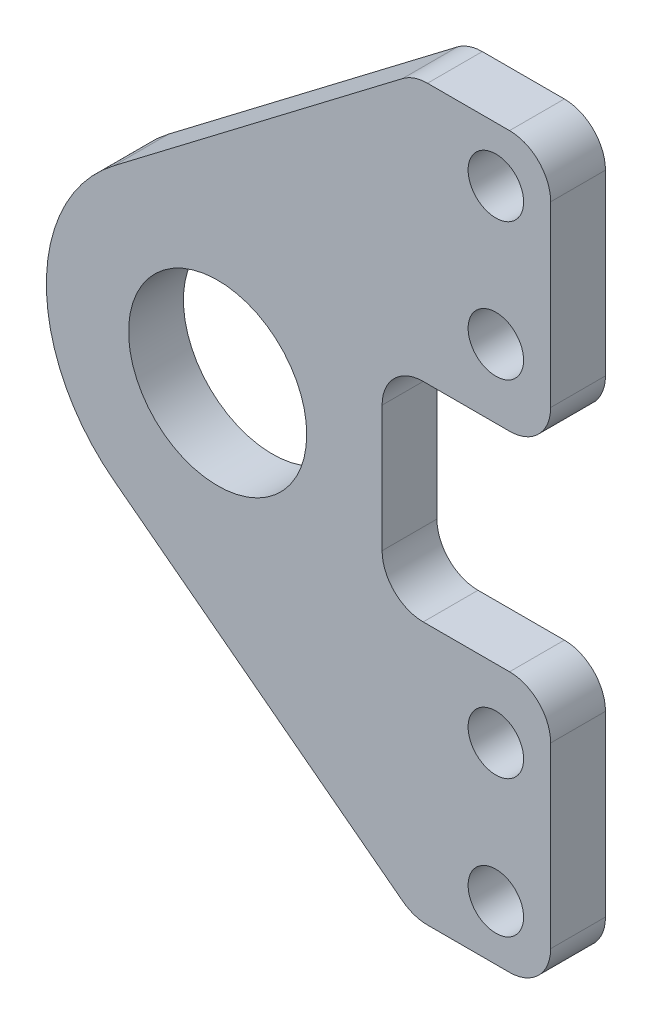
ISO-10303-21;
HEADER;
FILE_DESCRIPTION(('STEP AP214'),'2;1');
FILE_NAME('part.step','',(''),(''),'','','');
FILE_SCHEMA(('AUTOMOTIVE_DESIGN { 1 0 10303 214 1 1 1 1 }'));
ENDSEC;
DATA;
#1=APPLICATION_CONTEXT('core data for automotive mechanical design processes');
#2=APPLICATION_PROTOCOL_DEFINITION('international standard','automotive_design',2000,#1);
#3=PRODUCT_CONTEXT('',#1,'mechanical');
#4=PRODUCT('Part','Part','',(#3));
#5=PRODUCT_RELATED_PRODUCT_CATEGORY('part','',(#4));
#6=PRODUCT_DEFINITION_FORMATION('','',#4);
#7=PRODUCT_DEFINITION_CONTEXT('part definition',#1,'design');
#8=PRODUCT_DEFINITION('design','',#6,#7);
#9=PRODUCT_DEFINITION_SHAPE('','',#8);
#10=(LENGTH_UNIT() NAMED_UNIT(*) SI_UNIT(.MILLI.,.METRE.));
#11=(NAMED_UNIT(*) PLANE_ANGLE_UNIT() SI_UNIT($,.RADIAN.));
#12=(NAMED_UNIT(*) SI_UNIT($,.STERADIAN.) SOLID_ANGLE_UNIT());
#13=UNCERTAINTY_MEASURE_WITH_UNIT(LENGTH_MEASURE(1.E-05),#10,'distance_accuracy_value','');
#14=(GEOMETRIC_REPRESENTATION_CONTEXT(3) GLOBAL_UNCERTAINTY_ASSIGNED_CONTEXT((#13)) GLOBAL_UNIT_ASSIGNED_CONTEXT((#10,
#11,#12)) REPRESENTATION_CONTEXT('',''));
#15=CARTESIAN_POINT('',(0.,0.,0.));
#16=DIRECTION('',(0.,0.,1.));
#17=DIRECTION('',(1.,0.,0.));
#18=AXIS2_PLACEMENT_3D('',#15,#16,#17);
#19=CARTESIAN_POINT('',(24.3,26.6,2.));
#20=DIRECTION('',(-1.,0.,0.));
#21=DIRECTION('',(0.,0.,1.));
#22=AXIS2_PLACEMENT_3D('',#19,#20,#21);
#23=PLANE('',#22);
#24=DIRECTION('',(0.,1.,0.));
#25=VECTOR('',#24,1.);
#26=CARTESIAN_POINT('',(24.3,26.6,2.));
#27=LINE('',#26,#25);
#28=CARTESIAN_POINT('',(24.3,-23.6,2.));
#29=VERTEX_POINT('',#28);
#30=CARTESIAN_POINT('',(24.3,-10.6,2.));
#31=VERTEX_POINT('',#30);
#32=EDGE_CURVE('E227',#29,#31,#27,.T.);
#33=ORIENTED_EDGE('',*,*,#32,.F.);
#34=DIRECTION('',(0.,0.,-1.));
#35=VECTOR('',#34,1.);
#36=CARTESIAN_POINT('',(24.3,-23.6,2.));
#37=LINE('',#36,#35);
#38=CARTESIAN_POINT('',(24.3,-23.6,-2.));
#39=VERTEX_POINT('',#38);
#40=EDGE_CURVE('E293',#29,#39,#37,.T.);
#41=ORIENTED_EDGE('',*,*,#40,.T.);
#42=DIRECTION('',(0.,1.,0.));
#43=VECTOR('',#42,1.);
#44=CARTESIAN_POINT('',(24.3,26.6,-2.));
#45=LINE('',#44,#43);
#46=CARTESIAN_POINT('',(24.3,-10.6,-2.));
#47=VERTEX_POINT('',#46);
#48=EDGE_CURVE('E278',#39,#47,#45,.T.);
#49=ORIENTED_EDGE('',*,*,#48,.T.);
#50=DIRECTION('',(0.,0.,1.));
#51=VECTOR('',#50,1.);
#52=CARTESIAN_POINT('',(24.3,-10.6,2.));
#53=LINE('',#52,#51);
#54=EDGE_CURVE('E297',#47,#31,#53,.T.);
#55=ORIENTED_EDGE('',*,*,#54,.T.);
#56=EDGE_LOOP('',(#33,#41,#49,#55));
#57=FACE_BOUND('',#56,.T.);
#58=ADVANCED_FACE('F39',(#57),#23,.F.);
#59=CARTESIAN_POINT('',(0.,0.,2.));
#60=DIRECTION('',(0.,0.,1.));
#61=DIRECTION('',(1.,0.,0.));
#62=AXIS2_PLACEMENT_3D('',#59,#60,#61);
#63=PLANE('',#62);
#64=DIRECTION('',(-1.,0.,0.));
#65=VECTOR('',#64,1.);
#66=CARTESIAN_POINT('',(24.3,7.6,2.));
#67=LINE('',#66,#65);
#68=CARTESIAN_POINT('',(21.3,7.6,2.));
#69=VERTEX_POINT('',#68);
#70=CARTESIAN_POINT('',(15.,7.6,2.));
#71=VERTEX_POINT('',#70);
#72=EDGE_CURVE('E317',#69,#71,#67,.T.);
#73=ORIENTED_EDGE('',*,*,#72,.F.);
#74=CARTESIAN_POINT('',(21.3,10.6,2.));
#75=DIRECTION('',(0.,0.,1.));
#76=DIRECTION('',(1.,0.,0.));
#77=AXIS2_PLACEMENT_3D('',#74,#75,#76);
#78=CIRCLE('',#77,3.);
#79=CARTESIAN_POINT('',(24.3,10.6,2.));
#80=VERTEX_POINT('',#79);
#81=EDGE_CURVE('E431',#69,#80,#78,.T.);
#82=ORIENTED_EDGE('',*,*,#81,.T.);
#83=CARTESIAN_POINT('',(24.3,23.6,2.));
#84=VERTEX_POINT('',#83);
#85=EDGE_CURVE('E230',#80,#84,#27,.T.);
#86=ORIENTED_EDGE('',*,*,#85,.T.);
#87=CARTESIAN_POINT('',(21.3,23.6,2.));
#88=DIRECTION('',(0.,0.,1.));
#89=DIRECTION('',(1.,0.,0.));
#90=AXIS2_PLACEMENT_3D('',#87,#88,#89);
#91=CIRCLE('',#90,3.);
#92=CARTESIAN_POINT('',(21.3,26.6,2.));
#93=VERTEX_POINT('',#92);
#94=EDGE_CURVE('E219',#84,#93,#91,.T.);
#95=ORIENTED_EDGE('',*,*,#94,.T.);
#96=DIRECTION('',(-1.,0.,0.));
#97=VECTOR('',#96,1.);
#98=CARTESIAN_POINT('',(14.3,26.6,2.));
#99=LINE('',#98,#97);
#100=CARTESIAN_POINT('',(15.3121598693856,26.6,2.));
#101=VERTEX_POINT('',#100);
#102=EDGE_CURVE('E179',#93,#101,#99,.T.);
#103=ORIENTED_EDGE('',*,*,#102,.T.);
#104=CARTESIAN_POINT('',(15.3121598693856,23.6,2.));
#105=DIRECTION('',(0.,0.,1.));
#106=DIRECTION('',(1.,0.,0.));
#107=AXIS2_PLACEMENT_3D('',#104,#105,#106);
#108=CIRCLE('',#107,3.);
#109=CARTESIAN_POINT('',(13.4947189464612,25.9868197442789,2.));
#110=VERTEX_POINT('',#109);
#111=EDGE_CURVE('E175',#101,#110,#108,.T.);
#112=ORIENTED_EDGE('',*,*,#111,.T.);
#113=DIRECTION('',(-0.795606581426305,-0.605813640974804,0.));
#114=VECTOR('',#113,1.);
#115=CARTESIAN_POINT('',(-7.57267051218505,9.94508226782881,2.));
#116=LINE('',#115,#114);
#117=CARTESIAN_POINT('',(-7.57267051218505,9.94508226782881,2.));
#118=VERTEX_POINT('',#117);
#119=EDGE_CURVE('E164',#110,#118,#116,.T.);
#120=ORIENTED_EDGE('',*,*,#119,.T.);
#121=CARTESIAN_POINT('',(0.,0.,2.));
#122=DIRECTION('',(0.,0.,1.));
#123=DIRECTION('',(1.,0.,0.));
#124=AXIS2_PLACEMENT_3D('',#121,#122,#123);
#125=CIRCLE('',#124,12.5);
#126=CARTESIAN_POINT('',(-7.57267051218505,-9.94508226782881,2.));
#127=VERTEX_POINT('',#126);
#128=EDGE_CURVE('E171',#118,#127,#125,.T.);
#129=ORIENTED_EDGE('',*,*,#128,.T.);
#130=DIRECTION('',(0.795606581426305,-0.605813640974804,0.));
#131=VECTOR('',#130,1.);
#132=CARTESIAN_POINT('',(-7.57267051218505,-9.94508226782881,2.));
#133=LINE('',#132,#131);
#134=CARTESIAN_POINT('',(13.4947189464612,-25.9868197442789,2.));
#135=VERTEX_POINT('',#134);
#136=EDGE_CURVE('E194',#127,#135,#133,.T.);
#137=ORIENTED_EDGE('',*,*,#136,.T.);
#138=CARTESIAN_POINT('',(15.3121598693856,-23.6,2.));
#139=DIRECTION('',(0.,0.,1.));
#140=DIRECTION('',(1.,0.,0.));
#141=AXIS2_PLACEMENT_3D('',#138,#139,#140);
#142=CIRCLE('',#141,3.);
#143=CARTESIAN_POINT('',(15.3121598693856,-26.6,2.));
#144=VERTEX_POINT('',#143);
#145=EDGE_CURVE('E211',#135,#144,#142,.T.);
#146=ORIENTED_EDGE('',*,*,#145,.T.);
#147=DIRECTION('',(1.,0.,0.));
#148=VECTOR('',#147,1.);
#149=CARTESIAN_POINT('',(14.3,-26.6,2.));
#150=LINE('',#149,#148);
#151=CARTESIAN_POINT('',(21.3,-26.6,2.));
#152=VERTEX_POINT('',#151);
#153=EDGE_CURVE('E196',#144,#152,#150,.T.);
#154=ORIENTED_EDGE('',*,*,#153,.T.);
#155=CARTESIAN_POINT('',(21.3,-23.6,2.));
#156=DIRECTION('',(0.,0.,1.));
#157=DIRECTION('',(1.,0.,0.));
#158=AXIS2_PLACEMENT_3D('',#155,#156,#157);
#159=CIRCLE('',#158,3.);
#160=EDGE_CURVE('E62',#152,#29,#159,.T.);
#161=ORIENTED_EDGE('',*,*,#160,.T.);
#162=ORIENTED_EDGE('',*,*,#32,.T.);
#163=CARTESIAN_POINT('',(21.3,-10.6,2.));
#164=DIRECTION('',(0.,0.,1.));
#165=DIRECTION('',(1.,0.,0.));
#166=AXIS2_PLACEMENT_3D('',#163,#164,#165);
#167=CIRCLE('',#166,3.);
#168=CARTESIAN_POINT('',(21.3,-7.6,2.));
#169=VERTEX_POINT('',#168);
#170=EDGE_CURVE('E54',#31,#169,#167,.T.);
#171=ORIENTED_EDGE('',*,*,#170,.T.);
#172=DIRECTION('',(1.,0.,0.));
#173=VECTOR('',#172,1.);
#174=CARTESIAN_POINT('',(24.3,-7.6,2.));
#175=LINE('',#174,#173);
#176=CARTESIAN_POINT('',(15.,-7.6,2.));
#177=VERTEX_POINT('',#176);
#178=EDGE_CURVE('E357',#177,#169,#175,.T.);
#179=ORIENTED_EDGE('',*,*,#178,.F.);
#180=CARTESIAN_POINT('',(15.,-4.6,2.));
#181=DIRECTION('',(0.,0.,1.));
#182=DIRECTION('',(1.,0.,0.));
#183=AXIS2_PLACEMENT_3D('',#180,#181,#182);
#184=CIRCLE('',#183,3.);
#185=CARTESIAN_POINT('',(12.,-4.6,2.));
#186=VERTEX_POINT('',#185);
#187=EDGE_CURVE('E312',#177,#186,#184,.F.);
#188=ORIENTED_EDGE('',*,*,#187,.T.);
#189=DIRECTION('',(0.,-1.,0.));
#190=VECTOR('',#189,1.);
#191=CARTESIAN_POINT('',(12.,-7.6,2.));
#192=LINE('',#191,#190);
#193=CARTESIAN_POINT('',(12.,4.6,2.));
#194=VERTEX_POINT('',#193);
#195=EDGE_CURVE('E320',#194,#186,#192,.T.);
#196=ORIENTED_EDGE('',*,*,#195,.F.);
#197=CARTESIAN_POINT('',(15.,4.6,2.));
#198=DIRECTION('',(0.,0.,1.));
#199=DIRECTION('',(1.,0.,0.));
#200=AXIS2_PLACEMENT_3D('',#197,#198,#199);
#201=CIRCLE('',#200,3.);
#202=EDGE_CURVE('E47',#194,#71,#201,.F.);
#203=ORIENTED_EDGE('',*,*,#202,.T.);
#204=EDGE_LOOP('',(#73,#82,#86,#95,#103,#112,#120,#129,#137,#146,#154,#161,#162,#171,#179,#188,
#196,#203));
#205=FACE_BOUND('',#204,.T.);
#206=CARTESIAN_POINT('',(20.3,-12.6,2.));
#207=DIRECTION('',(0.,0.,1.));
#208=DIRECTION('',(1.,0.,0.));
#209=AXIS2_PLACEMENT_3D('',#206,#207,#208);
#210=CIRCLE('',#209,2.025);
#211=CARTESIAN_POINT('',(22.325,-12.6,2.));
#212=VERTEX_POINT('',#211);
#213=EDGE_CURVE('E363',#212,#212,#210,.T.);
#214=ORIENTED_EDGE('',*,*,#213,.F.);
#215=EDGE_LOOP('',(#214));
#216=FACE_BOUND('',#215,.T.);
#217=CARTESIAN_POINT('',(20.3,22.6,2.));
#218=DIRECTION('',(0.,0.,1.));
#219=DIRECTION('',(1.,0.,0.));
#220=AXIS2_PLACEMENT_3D('',#217,#218,#219);
#221=CIRCLE('',#220,2.025);
#222=CARTESIAN_POINT('',(22.325,22.6,2.));
#223=VERTEX_POINT('',#222);
#224=EDGE_CURVE('E374',#223,#223,#221,.T.);
#225=ORIENTED_EDGE('',*,*,#224,.F.);
#226=EDGE_LOOP('',(#225));
#227=FACE_BOUND('',#226,.T.);
#228=CARTESIAN_POINT('',(0.,0.,2.));
#229=DIRECTION('',(0.,0.,1.));
#230=DIRECTION('',(1.,0.,0.));
#231=AXIS2_PLACEMENT_3D('',#228,#229,#230);
#232=CIRCLE('',#231,6.5);
#233=CARTESIAN_POINT('',(6.5,0.,2.));
#234=VERTEX_POINT('',#233);
#235=EDGE_CURVE('E382',#234,#234,#232,.T.);
#236=ORIENTED_EDGE('',*,*,#235,.F.);
#237=EDGE_LOOP('',(#236));
#238=FACE_BOUND('',#237,.T.);
#239=CARTESIAN_POINT('',(20.3,12.6,2.));
#240=DIRECTION('',(0.,0.,1.));
#241=DIRECTION('',(1.,0.,0.));
#242=AXIS2_PLACEMENT_3D('',#239,#240,#241);
#243=CIRCLE('',#242,2.025);
#244=CARTESIAN_POINT('',(22.325,12.6,2.));
#245=VERTEX_POINT('',#244);
#246=EDGE_CURVE('E381',#245,#245,#243,.T.);
#247=ORIENTED_EDGE('',*,*,#246,.F.);
#248=EDGE_LOOP('',(#247));
#249=FACE_BOUND('',#248,.T.);
#250=CARTESIAN_POINT('',(20.3,-22.6,2.));
#251=DIRECTION('',(0.,0.,1.));
#252=DIRECTION('',(1.,0.,0.));
#253=AXIS2_PLACEMENT_3D('',#250,#251,#252);
#254=CIRCLE('',#253,2.025);
#255=CARTESIAN_POINT('',(22.325,-22.6,2.));
#256=VERTEX_POINT('',#255);
#257=EDGE_CURVE('E355',#256,#256,#254,.T.);
#258=ORIENTED_EDGE('',*,*,#257,.F.);
#259=EDGE_LOOP('',(#258));
#260=FACE_BOUND('',#259,.T.);
#261=ADVANCED_FACE('F167',(#205,#216,#227,#238,#249,#260),#63,.T.);
#262=CARTESIAN_POINT('',(0.,0.,-2.));
#263=DIRECTION('',(0.,0.,1.));
#264=DIRECTION('',(1.,0.,0.));
#265=AXIS2_PLACEMENT_3D('',#262,#263,#264);
#266=PLANE('',#265);
#267=CARTESIAN_POINT('',(24.3,10.6,-2.));
#268=VERTEX_POINT('',#267);
#269=CARTESIAN_POINT('',(24.3,23.6,-2.));
#270=VERTEX_POINT('',#269);
#271=EDGE_CURVE('E280',#268,#270,#45,.T.);
#272=ORIENTED_EDGE('',*,*,#271,.F.);
#273=CARTESIAN_POINT('',(21.3,10.6,-2.));
#274=DIRECTION('',(0.,0.,1.));
#275=DIRECTION('',(1.,0.,0.));
#276=AXIS2_PLACEMENT_3D('',#273,#274,#275);
#277=CIRCLE('',#276,3.);
#278=CARTESIAN_POINT('',(21.3,7.6,-2.));
#279=VERTEX_POINT('',#278);
#280=EDGE_CURVE('E246',#268,#279,#277,.F.);
#281=ORIENTED_EDGE('',*,*,#280,.T.);
#282=DIRECTION('',(-1.,0.,0.));
#283=VECTOR('',#282,1.);
#284=CARTESIAN_POINT('',(0.,7.6,-2.));
#285=LINE('',#284,#283);
#286=CARTESIAN_POINT('',(15.,7.6,-2.));
#287=VERTEX_POINT('',#286);
#288=EDGE_CURVE('E337',#279,#287,#285,.T.);
#289=ORIENTED_EDGE('',*,*,#288,.T.);
#290=CARTESIAN_POINT('',(15.,4.6,-2.));
#291=DIRECTION('',(0.,0.,1.));
#292=DIRECTION('',(1.,0.,0.));
#293=AXIS2_PLACEMENT_3D('',#290,#291,#292);
#294=CIRCLE('',#293,3.);
#295=CARTESIAN_POINT('',(12.,4.6,-2.));
#296=VERTEX_POINT('',#295);
#297=EDGE_CURVE('E12',#287,#296,#294,.T.);
#298=ORIENTED_EDGE('',*,*,#297,.T.);
#299=DIRECTION('',(0.,-1.,0.));
#300=VECTOR('',#299,1.);
#301=CARTESIAN_POINT('',(12.,0.,-2.));
#302=LINE('',#301,#300);
#303=CARTESIAN_POINT('',(12.,-4.6,-2.));
#304=VERTEX_POINT('',#303);
#305=EDGE_CURVE('E188',#296,#304,#302,.T.);
#306=ORIENTED_EDGE('',*,*,#305,.T.);
#307=CARTESIAN_POINT('',(15.,-4.6,-2.));
#308=DIRECTION('',(0.,0.,1.));
#309=DIRECTION('',(1.,0.,0.));
#310=AXIS2_PLACEMENT_3D('',#307,#308,#309);
#311=CIRCLE('',#310,3.);
#312=CARTESIAN_POINT('',(15.,-7.6,-2.));
#313=VERTEX_POINT('',#312);
#314=EDGE_CURVE('E314',#304,#313,#311,.T.);
#315=ORIENTED_EDGE('',*,*,#314,.T.);
#316=DIRECTION('',(1.,0.,0.));
#317=VECTOR('',#316,1.);
#318=CARTESIAN_POINT('',(0.,-7.6,-2.));
#319=LINE('',#318,#317);
#320=CARTESIAN_POINT('',(21.3,-7.6,-2.));
#321=VERTEX_POINT('',#320);
#322=EDGE_CURVE('E346',#313,#321,#319,.T.);
#323=ORIENTED_EDGE('',*,*,#322,.T.);
#324=CARTESIAN_POINT('',(21.3,-10.6,-2.));
#325=DIRECTION('',(0.,0.,1.));
#326=DIRECTION('',(1.,0.,0.));
#327=AXIS2_PLACEMENT_3D('',#324,#325,#326);
#328=CIRCLE('',#327,3.);
#329=EDGE_CURVE('E256',#321,#47,#328,.F.);
#330=ORIENTED_EDGE('',*,*,#329,.T.);
#331=ORIENTED_EDGE('',*,*,#48,.F.);
#332=CARTESIAN_POINT('',(21.3,-23.6,-2.));
#333=DIRECTION('',(0.,0.,1.));
#334=DIRECTION('',(1.,0.,0.));
#335=AXIS2_PLACEMENT_3D('',#332,#333,#334);
#336=CIRCLE('',#335,3.);
#337=CARTESIAN_POINT('',(21.3,-26.6,-2.));
#338=VERTEX_POINT('',#337);
#339=EDGE_CURVE('E254',#39,#338,#336,.F.);
#340=ORIENTED_EDGE('',*,*,#339,.T.);
#341=DIRECTION('',(1.,0.,0.));
#342=VECTOR('',#341,1.);
#343=CARTESIAN_POINT('',(14.3,-26.6,-2.));
#344=LINE('',#343,#342);
#345=CARTESIAN_POINT('',(15.3121598693856,-26.6,-2.));
#346=VERTEX_POINT('',#345);
#347=EDGE_CURVE('E266',#346,#338,#344,.T.);
#348=ORIENTED_EDGE('',*,*,#347,.F.);
#349=CARTESIAN_POINT('',(15.3121598693856,-23.6,-2.));
#350=DIRECTION('',(0.,0.,1.));
#351=DIRECTION('',(1.,0.,0.));
#352=AXIS2_PLACEMENT_3D('',#349,#350,#351);
#353=CIRCLE('',#352,3.);
#354=CARTESIAN_POINT('',(13.4947189464612,-25.9868197442789,-2.));
#355=VERTEX_POINT('',#354);
#356=EDGE_CURVE('E252',#346,#355,#353,.F.);
#357=ORIENTED_EDGE('',*,*,#356,.T.);
#358=DIRECTION('',(0.795606581426305,-0.605813640974804,0.));
#359=VECTOR('',#358,1.);
#360=CARTESIAN_POINT('',(-7.57267051218505,-9.94508226782881,-2.));
#361=LINE('',#360,#359);
#362=CARTESIAN_POINT('',(-7.57267051218505,-9.94508226782881,-2.));
#363=VERTEX_POINT('',#362);
#364=EDGE_CURVE('E269',#363,#355,#361,.T.);
#365=ORIENTED_EDGE('',*,*,#364,.F.);
#366=CARTESIAN_POINT('',(0.,0.,-2.));
#367=DIRECTION('',(0.,0.,1.));
#368=DIRECTION('',(1.,0.,0.));
#369=AXIS2_PLACEMENT_3D('',#366,#367,#368);
#370=CIRCLE('',#369,12.5);
#371=CARTESIAN_POINT('',(-7.57267051218505,9.94508226782881,-2.));
#372=VERTEX_POINT('',#371);
#373=EDGE_CURVE('E272',#372,#363,#370,.T.);
#374=ORIENTED_EDGE('',*,*,#373,.F.);
#375=DIRECTION('',(-0.795606581426305,-0.605813640974804,0.));
#376=VECTOR('',#375,1.);
#377=CARTESIAN_POINT('',(-7.57267051218505,9.94508226782881,-2.));
#378=LINE('',#377,#376);
#379=CARTESIAN_POINT('',(13.4947189464612,25.9868197442789,-2.));
#380=VERTEX_POINT('',#379);
#381=EDGE_CURVE('E185',#380,#372,#378,.T.);
#382=ORIENTED_EDGE('',*,*,#381,.F.);
#383=CARTESIAN_POINT('',(15.3121598693856,23.6,-2.));
#384=DIRECTION('',(0.,0.,1.));
#385=DIRECTION('',(1.,0.,0.));
#386=AXIS2_PLACEMENT_3D('',#383,#384,#385);
#387=CIRCLE('',#386,3.);
#388=CARTESIAN_POINT('',(15.3121598693856,26.6,-2.));
#389=VERTEX_POINT('',#388);
#390=EDGE_CURVE('E250',#380,#389,#387,.F.);
#391=ORIENTED_EDGE('',*,*,#390,.T.);
#392=DIRECTION('',(-1.,0.,0.));
#393=VECTOR('',#392,1.);
#394=CARTESIAN_POINT('',(14.3,26.6,-2.));
#395=LINE('',#394,#393);
#396=CARTESIAN_POINT('',(21.3,26.6,-2.));
#397=VERTEX_POINT('',#396);
#398=EDGE_CURVE('E275',#397,#389,#395,.T.);
#399=ORIENTED_EDGE('',*,*,#398,.F.);
#400=CARTESIAN_POINT('',(21.3,23.6,-2.));
#401=DIRECTION('',(0.,0.,1.));
#402=DIRECTION('',(1.,0.,0.));
#403=AXIS2_PLACEMENT_3D('',#400,#401,#402);
#404=CIRCLE('',#403,3.);
#405=EDGE_CURVE('E248',#397,#270,#404,.F.);
#406=ORIENTED_EDGE('',*,*,#405,.T.);
#407=EDGE_LOOP('',(#272,#281,#289,#298,#306,#315,#323,#330,#331,#340,#348,#357,#365,#374,#382,
#391,#399,#406));
#408=FACE_BOUND('',#407,.T.);
#409=CARTESIAN_POINT('',(0.,0.,-2.));
#410=DIRECTION('',(0.,0.,1.));
#411=DIRECTION('',(1.,0.,0.));
#412=AXIS2_PLACEMENT_3D('',#409,#410,#411);
#413=CIRCLE('',#412,6.5);
#414=CARTESIAN_POINT('',(6.5,0.,-2.));
#415=VERTEX_POINT('',#414);
#416=EDGE_CURVE('E231',#415,#415,#413,.T.);
#417=ORIENTED_EDGE('',*,*,#416,.T.);
#418=EDGE_LOOP('',(#417));
#419=FACE_BOUND('',#418,.T.);
#420=CARTESIAN_POINT('',(20.3,22.6,-2.));
#421=DIRECTION('',(0.,0.,1.));
#422=DIRECTION('',(1.,0.,0.));
#423=AXIS2_PLACEMENT_3D('',#420,#421,#422);
#424=CIRCLE('',#423,2.025);
#425=CARTESIAN_POINT('',(22.325,22.6,-2.));
#426=VERTEX_POINT('',#425);
#427=EDGE_CURVE('E379',#426,#426,#424,.T.);
#428=ORIENTED_EDGE('',*,*,#427,.T.);
#429=EDGE_LOOP('',(#428));
#430=FACE_BOUND('',#429,.T.);
#431=CARTESIAN_POINT('',(20.3,12.6,-2.));
#432=DIRECTION('',(0.,0.,1.));
#433=DIRECTION('',(1.,0.,0.));
#434=AXIS2_PLACEMENT_3D('',#431,#432,#433);
#435=CIRCLE('',#434,2.025);
#436=CARTESIAN_POINT('',(22.325,12.6,-2.));
#437=VERTEX_POINT('',#436);
#438=EDGE_CURVE('E367',#437,#437,#435,.T.);
#439=ORIENTED_EDGE('',*,*,#438,.T.);
#440=EDGE_LOOP('',(#439));
#441=FACE_BOUND('',#440,.T.);
#442=CARTESIAN_POINT('',(20.3,-12.6,-2.));
#443=DIRECTION('',(0.,0.,1.));
#444=DIRECTION('',(1.,0.,0.));
#445=AXIS2_PLACEMENT_3D('',#442,#443,#444);
#446=CIRCLE('',#445,2.025);
#447=CARTESIAN_POINT('',(22.325,-12.6,-2.));
#448=VERTEX_POINT('',#447);
#449=EDGE_CURVE('E361',#448,#448,#446,.T.);
#450=ORIENTED_EDGE('',*,*,#449,.T.);
#451=EDGE_LOOP('',(#450));
#452=FACE_BOUND('',#451,.T.);
#453=CARTESIAN_POINT('',(20.3,-22.6,-2.));
#454=DIRECTION('',(0.,0.,1.));
#455=DIRECTION('',(1.,0.,0.));
#456=AXIS2_PLACEMENT_3D('',#453,#454,#455);
#457=CIRCLE('',#456,2.025);
#458=CARTESIAN_POINT('',(22.325,-22.6,-2.));
#459=VERTEX_POINT('',#458);
#460=EDGE_CURVE('E352',#459,#459,#457,.T.);
#461=ORIENTED_EDGE('',*,*,#460,.T.);
#462=EDGE_LOOP('',(#461));
#463=FACE_BOUND('',#462,.T.);
#464=ADVANCED_FACE('F334',(#408,#419,#430,#441,#452,#463),#266,.F.);
#465=ORIENTED_EDGE('',*,*,#85,.F.);
#466=DIRECTION('',(0.,0.,-1.));
#467=VECTOR('',#466,1.);
#468=CARTESIAN_POINT('',(24.3,10.6,2.));
#469=LINE('',#468,#467);
#470=EDGE_CURVE('E258',#80,#268,#469,.T.);
#471=ORIENTED_EDGE('',*,*,#470,.T.);
#472=ORIENTED_EDGE('',*,*,#271,.T.);
#473=DIRECTION('',(0.,0.,-1.));
#474=VECTOR('',#473,1.);
#475=CARTESIAN_POINT('',(24.3,23.6,2.));
#476=LINE('',#475,#474);
#477=EDGE_CURVE('E261',#270,#84,#476,.F.);
#478=ORIENTED_EDGE('',*,*,#477,.T.);
#479=EDGE_LOOP('',(#465,#471,#472,#478));
#480=FACE_BOUND('',#479,.T.);
#481=ADVANCED_FACE('F409',(#480),#23,.F.);
#482=CARTESIAN_POINT('',(14.3,26.6,2.));
#483=DIRECTION('',(0.,-1.,0.));
#484=DIRECTION('',(1.,0.,0.));
#485=AXIS2_PLACEMENT_3D('',#482,#483,#484);
#486=PLANE('',#485);
#487=ORIENTED_EDGE('',*,*,#102,.F.);
#488=DIRECTION('',(0.,0.,-1.));
#489=VECTOR('',#488,1.);
#490=CARTESIAN_POINT('',(21.3,26.6,2.));
#491=LINE('',#490,#489);
#492=EDGE_CURVE('E437',#93,#397,#491,.T.);
#493=ORIENTED_EDGE('',*,*,#492,.T.);
#494=ORIENTED_EDGE('',*,*,#398,.T.);
#495=DIRECTION('',(0.,0.,-1.));
#496=VECTOR('',#495,1.);
#497=CARTESIAN_POINT('',(15.3121598693856,26.6,2.));
#498=LINE('',#497,#496);
#499=EDGE_CURVE('E439',#389,#101,#498,.F.);
#500=ORIENTED_EDGE('',*,*,#499,.T.);
#501=EDGE_LOOP('',(#487,#493,#494,#500));
#502=FACE_BOUND('',#501,.T.);
#503=ADVANCED_FACE('F416',(#502),#486,.F.);
#504=CARTESIAN_POINT('',(-7.57267051218505,9.94508226782881,2.));
#505=DIRECTION('',(0.605813640974804,-0.795606581426305,0.));
#506=DIRECTION('',(0.795606581426305,0.605813640974804,0.));
#507=AXIS2_PLACEMENT_3D('',#504,#505,#506);
#508=PLANE('',#507);
#509=ORIENTED_EDGE('',*,*,#119,.F.);
#510=DIRECTION('',(0.,0.,-1.));
#511=VECTOR('',#510,1.);
#512=CARTESIAN_POINT('',(13.4947189464612,25.9868197442789,2.));
#513=LINE('',#512,#511);
#514=EDGE_CURVE('E452',#110,#380,#513,.T.);
#515=ORIENTED_EDGE('',*,*,#514,.T.);
#516=ORIENTED_EDGE('',*,*,#381,.T.);
#517=DIRECTION('',(0.,0.,-1.));
#518=VECTOR('',#517,1.);
#519=CARTESIAN_POINT('',(-7.57267051218505,9.94508226782881,2.));
#520=LINE('',#519,#518);
#521=EDGE_CURVE('E182',#118,#372,#520,.T.);
#522=ORIENTED_EDGE('',*,*,#521,.F.);
#523=EDGE_LOOP('',(#509,#515,#516,#522));
#524=FACE_BOUND('',#523,.T.);
#525=ADVANCED_FACE('F183',(#524),#508,.F.);
#526=CARTESIAN_POINT('',(0.,0.,2.));
#527=DIRECTION('',(0.,0.,-1.));
#528=DIRECTION('',(-1.,0.,0.));
#529=AXIS2_PLACEMENT_3D('',#526,#527,#528);
#530=CYLINDRICAL_SURFACE('',#529,12.5);
#531=ORIENTED_EDGE('',*,*,#373,.T.);
#532=DIRECTION('',(0.,0.,-1.));
#533=VECTOR('',#532,1.);
#534=CARTESIAN_POINT('',(-7.57267051218505,-9.94508226782881,2.));
#535=LINE('',#534,#533);
#536=EDGE_CURVE('E189',#127,#363,#535,.T.);
#537=ORIENTED_EDGE('',*,*,#536,.F.);
#538=ORIENTED_EDGE('',*,*,#128,.F.);
#539=ORIENTED_EDGE('',*,*,#521,.T.);
#540=EDGE_LOOP('',(#531,#537,#538,#539));
#541=FACE_BOUND('',#540,.T.);
#542=ADVANCED_FACE('F191',(#541),#530,.T.);
#543=CARTESIAN_POINT('',(-7.57267051218505,-9.94508226782881,2.));
#544=DIRECTION('',(0.605813640974804,0.795606581426305,0.));
#545=DIRECTION('',(-0.795606581426305,0.605813640974804,0.));
#546=AXIS2_PLACEMENT_3D('',#543,#544,#545);
#547=PLANE('',#546);
#548=ORIENTED_EDGE('',*,*,#364,.T.);
#549=DIRECTION('',(0.,0.,-1.));
#550=VECTOR('',#549,1.);
#551=CARTESIAN_POINT('',(13.4947189464612,-25.9868197442789,2.));
#552=LINE('',#551,#550);
#553=EDGE_CURVE('E302',#355,#135,#552,.F.);
#554=ORIENTED_EDGE('',*,*,#553,.T.);
#555=ORIENTED_EDGE('',*,*,#136,.F.);
#556=ORIENTED_EDGE('',*,*,#536,.T.);
#557=EDGE_LOOP('',(#548,#554,#555,#556));
#558=FACE_BOUND('',#557,.T.);
#559=ADVANCED_FACE('F404',(#558),#547,.F.);
#560=CARTESIAN_POINT('',(14.3,-26.6,2.));
#561=DIRECTION('',(0.,1.,0.));
#562=DIRECTION('',(-1.,0.,0.));
#563=AXIS2_PLACEMENT_3D('',#560,#561,#562);
#564=PLANE('',#563);
#565=ORIENTED_EDGE('',*,*,#153,.F.);
#566=DIRECTION('',(0.,0.,-1.));
#567=VECTOR('',#566,1.);
#568=CARTESIAN_POINT('',(15.3121598693856,-26.6,2.));
#569=LINE('',#568,#567);
#570=EDGE_CURVE('E449',#144,#346,#569,.T.);
#571=ORIENTED_EDGE('',*,*,#570,.T.);
#572=ORIENTED_EDGE('',*,*,#347,.T.);
#573=DIRECTION('',(0.,0.,-1.));
#574=VECTOR('',#573,1.);
#575=CARTESIAN_POINT('',(21.3,-26.6,2.));
#576=LINE('',#575,#574);
#577=EDGE_CURVE('E291',#338,#152,#576,.F.);
#578=ORIENTED_EDGE('',*,*,#577,.T.);
#579=EDGE_LOOP('',(#565,#571,#572,#578));
#580=FACE_BOUND('',#579,.T.);
#581=ADVANCED_FACE('F395',(#580),#564,.F.);
#582=CARTESIAN_POINT('',(0.,0.,2.));
#583=DIRECTION('',(0.,0.,-1.));
#584=DIRECTION('',(-1.,0.,0.));
#585=AXIS2_PLACEMENT_3D('',#582,#583,#584);
#586=CYLINDRICAL_SURFACE('',#585,6.5);
#587=ORIENTED_EDGE('',*,*,#235,.T.);
#588=EDGE_LOOP('',(#587));
#589=FACE_BOUND('',#588,.T.);
#590=ORIENTED_EDGE('',*,*,#416,.F.);
#591=EDGE_LOOP('',(#590));
#592=FACE_BOUND('',#591,.T.);
#593=ADVANCED_FACE('F392',(#589,#592),#586,.F.);
#594=CARTESIAN_POINT('',(20.3,22.6,2.));
#595=DIRECTION('',(0.,0.,-1.));
#596=DIRECTION('',(-1.,0.,0.));
#597=AXIS2_PLACEMENT_3D('',#594,#595,#596);
#598=CYLINDRICAL_SURFACE('',#597,2.025);
#599=ORIENTED_EDGE('',*,*,#224,.T.);
#600=EDGE_LOOP('',(#599));
#601=FACE_BOUND('',#600,.T.);
#602=ORIENTED_EDGE('',*,*,#427,.F.);
#603=EDGE_LOOP('',(#602));
#604=FACE_BOUND('',#603,.T.);
#605=ADVANCED_FACE('F394',(#601,#604),#598,.F.);
#606=CARTESIAN_POINT('',(20.3,12.6,2.));
#607=DIRECTION('',(0.,0.,-1.));
#608=DIRECTION('',(-1.,0.,0.));
#609=AXIS2_PLACEMENT_3D('',#606,#607,#608);
#610=CYLINDRICAL_SURFACE('',#609,2.025);
#611=ORIENTED_EDGE('',*,*,#246,.T.);
#612=EDGE_LOOP('',(#611));
#613=FACE_BOUND('',#612,.T.);
#614=ORIENTED_EDGE('',*,*,#438,.F.);
#615=EDGE_LOOP('',(#614));
#616=FACE_BOUND('',#615,.T.);
#617=ADVANCED_FACE('F401',(#613,#616),#610,.F.);
#618=CARTESIAN_POINT('',(20.3,-12.6,2.));
#619=DIRECTION('',(0.,0.,-1.));
#620=DIRECTION('',(-1.,0.,0.));
#621=AXIS2_PLACEMENT_3D('',#618,#619,#620);
#622=CYLINDRICAL_SURFACE('',#621,2.025);
#623=ORIENTED_EDGE('',*,*,#213,.T.);
#624=EDGE_LOOP('',(#623));
#625=FACE_BOUND('',#624,.T.);
#626=ORIENTED_EDGE('',*,*,#449,.F.);
#627=EDGE_LOOP('',(#626));
#628=FACE_BOUND('',#627,.T.);
#629=ADVANCED_FACE('F602',(#625,#628),#622,.F.);
#630=CARTESIAN_POINT('',(20.3,-22.6,2.));
#631=DIRECTION('',(0.,0.,-1.));
#632=DIRECTION('',(-1.,0.,0.));
#633=AXIS2_PLACEMENT_3D('',#630,#631,#632);
#634=CYLINDRICAL_SURFACE('',#633,2.025);
#635=ORIENTED_EDGE('',*,*,#257,.T.);
#636=EDGE_LOOP('',(#635));
#637=FACE_BOUND('',#636,.T.);
#638=ORIENTED_EDGE('',*,*,#460,.F.);
#639=EDGE_LOOP('',(#638));
#640=FACE_BOUND('',#639,.T.);
#641=ADVANCED_FACE('F541',(#637,#640),#634,.F.);
#642=CARTESIAN_POINT('',(12.,-7.6,-8.));
#643=DIRECTION('',(-1.,0.,0.));
#644=DIRECTION('',(0.,0.,1.));
#645=AXIS2_PLACEMENT_3D('',#642,#643,#644);
#646=PLANE('',#645);
#647=ORIENTED_EDGE('',*,*,#195,.T.);
#648=DIRECTION('',(0.,0.,1.));
#649=VECTOR('',#648,1.);
#650=CARTESIAN_POINT('',(12.,-4.6,-2.));
#651=LINE('',#650,#649);
#652=EDGE_CURVE('E310',#186,#304,#651,.F.);
#653=ORIENTED_EDGE('',*,*,#652,.T.);
#654=ORIENTED_EDGE('',*,*,#305,.F.);
#655=DIRECTION('',(0.,0.,1.));
#656=VECTOR('',#655,1.);
#657=CARTESIAN_POINT('',(12.,4.6,2.));
#658=LINE('',#657,#656);
#659=EDGE_CURVE('E307',#296,#194,#658,.T.);
#660=ORIENTED_EDGE('',*,*,#659,.T.);
#661=EDGE_LOOP('',(#647,#653,#654,#660));
#662=FACE_BOUND('',#661,.T.);
#663=ADVANCED_FACE('F339',(#662),#646,.F.);
#664=CARTESIAN_POINT('',(24.3,-7.6,-8.));
#665=DIRECTION('',(0.,-1.,0.));
#666=DIRECTION('',(1.,0.,0.));
#667=AXIS2_PLACEMENT_3D('',#664,#665,#666);
#668=PLANE('',#667);
#669=ORIENTED_EDGE('',*,*,#178,.T.);
#670=DIRECTION('',(0.,0.,1.));
#671=VECTOR('',#670,1.);
#672=CARTESIAN_POINT('',(21.3,-7.6,-8.));
#673=LINE('',#672,#671);
#674=EDGE_CURVE('E300',#169,#321,#673,.F.);
#675=ORIENTED_EDGE('',*,*,#674,.T.);
#676=ORIENTED_EDGE('',*,*,#322,.F.);
#677=DIRECTION('',(0.,0.,1.));
#678=VECTOR('',#677,1.);
#679=CARTESIAN_POINT('',(15.,-7.6,2.));
#680=LINE('',#679,#678);
#681=EDGE_CURVE('E296',#313,#177,#680,.T.);
#682=ORIENTED_EDGE('',*,*,#681,.T.);
#683=EDGE_LOOP('',(#669,#675,#676,#682));
#684=FACE_BOUND('',#683,.T.);
#685=ADVANCED_FACE('F350',(#684),#668,.F.);
#686=CARTESIAN_POINT('',(24.3,7.6,-8.));
#687=DIRECTION('',(0.,1.,0.));
#688=DIRECTION('',(-1.,0.,0.));
#689=AXIS2_PLACEMENT_3D('',#686,#687,#688);
#690=PLANE('',#689);
#691=ORIENTED_EDGE('',*,*,#288,.F.);
#692=DIRECTION('',(0.,0.,-1.));
#693=VECTOR('',#692,1.);
#694=CARTESIAN_POINT('',(21.3,7.6,-8.));
#695=LINE('',#694,#693);
#696=EDGE_CURVE('E242',#279,#69,#695,.F.);
#697=ORIENTED_EDGE('',*,*,#696,.T.);
#698=ORIENTED_EDGE('',*,*,#72,.T.);
#699=DIRECTION('',(0.,0.,1.));
#700=VECTOR('',#699,1.);
#701=CARTESIAN_POINT('',(15.,7.6,-2.));
#702=LINE('',#701,#700);
#703=EDGE_CURVE('E244',#71,#287,#702,.F.);
#704=ORIENTED_EDGE('',*,*,#703,.T.);
#705=EDGE_LOOP('',(#691,#697,#698,#704));
#706=FACE_BOUND('',#705,.T.);
#707=ADVANCED_FACE('F326',(#706),#690,.F.);
#708=CARTESIAN_POINT('',(21.3,10.6,2.));
#709=DIRECTION('',(0.,0.,-1.));
#710=DIRECTION('',(-1.,0.,0.));
#711=AXIS2_PLACEMENT_3D('',#708,#709,#710);
#712=CYLINDRICAL_SURFACE('',#711,3.);
#713=ORIENTED_EDGE('',*,*,#81,.F.);
#714=ORIENTED_EDGE('',*,*,#696,.F.);
#715=ORIENTED_EDGE('',*,*,#280,.F.);
#716=ORIENTED_EDGE('',*,*,#470,.F.);
#717=EDGE_LOOP('',(#713,#714,#715,#716));
#718=FACE_BOUND('',#717,.T.);
#719=ADVANCED_FACE('F430',(#718),#712,.T.);
#720=CARTESIAN_POINT('',(21.3,23.6,2.));
#721=DIRECTION('',(0.,0.,-1.));
#722=DIRECTION('',(-1.,0.,0.));
#723=AXIS2_PLACEMENT_3D('',#720,#721,#722);
#724=CYLINDRICAL_SURFACE('',#723,3.);
#725=ORIENTED_EDGE('',*,*,#94,.F.);
#726=ORIENTED_EDGE('',*,*,#477,.F.);
#727=ORIENTED_EDGE('',*,*,#405,.F.);
#728=ORIENTED_EDGE('',*,*,#492,.F.);
#729=EDGE_LOOP('',(#725,#726,#727,#728));
#730=FACE_BOUND('',#729,.T.);
#731=ADVANCED_FACE('F434',(#730),#724,.T.);
#732=CARTESIAN_POINT('',(15.3121598693856,23.6,2.));
#733=DIRECTION('',(0.,0.,-1.));
#734=DIRECTION('',(-1.,0.,0.));
#735=AXIS2_PLACEMENT_3D('',#732,#733,#734);
#736=CYLINDRICAL_SURFACE('',#735,3.);
#737=ORIENTED_EDGE('',*,*,#111,.F.);
#738=ORIENTED_EDGE('',*,*,#499,.F.);
#739=ORIENTED_EDGE('',*,*,#390,.F.);
#740=ORIENTED_EDGE('',*,*,#514,.F.);
#741=EDGE_LOOP('',(#737,#738,#739,#740));
#742=FACE_BOUND('',#741,.T.);
#743=ADVANCED_FACE('F457',(#742),#736,.T.);
#744=CARTESIAN_POINT('',(15.3121598693856,-23.6,2.));
#745=DIRECTION('',(0.,0.,-1.));
#746=DIRECTION('',(-1.,0.,0.));
#747=AXIS2_PLACEMENT_3D('',#744,#745,#746);
#748=CYLINDRICAL_SURFACE('',#747,3.);
#749=ORIENTED_EDGE('',*,*,#145,.F.);
#750=ORIENTED_EDGE('',*,*,#553,.F.);
#751=ORIENTED_EDGE('',*,*,#356,.F.);
#752=ORIENTED_EDGE('',*,*,#570,.F.);
#753=EDGE_LOOP('',(#749,#750,#751,#752));
#754=FACE_BOUND('',#753,.T.);
#755=ADVANCED_FACE('F459',(#754),#748,.T.);
#756=CARTESIAN_POINT('',(21.3,-23.6,2.));
#757=DIRECTION('',(0.,0.,-1.));
#758=DIRECTION('',(-1.,0.,0.));
#759=AXIS2_PLACEMENT_3D('',#756,#757,#758);
#760=CYLINDRICAL_SURFACE('',#759,3.);
#761=ORIENTED_EDGE('',*,*,#160,.F.);
#762=ORIENTED_EDGE('',*,*,#577,.F.);
#763=ORIENTED_EDGE('',*,*,#339,.F.);
#764=ORIENTED_EDGE('',*,*,#40,.F.);
#765=EDGE_LOOP('',(#761,#762,#763,#764));
#766=FACE_BOUND('',#765,.T.);
#767=ADVANCED_FACE('F290',(#766),#760,.T.);
#768=CARTESIAN_POINT('',(21.3,-10.6,2.));
#769=DIRECTION('',(0.,0.,1.));
#770=DIRECTION('',(1.,0.,0.));
#771=AXIS2_PLACEMENT_3D('',#768,#769,#770);
#772=CYLINDRICAL_SURFACE('',#771,3.);
#773=ORIENTED_EDGE('',*,*,#329,.F.);
#774=ORIENTED_EDGE('',*,*,#674,.F.);
#775=ORIENTED_EDGE('',*,*,#170,.F.);
#776=ORIENTED_EDGE('',*,*,#54,.F.);
#777=EDGE_LOOP('',(#773,#774,#775,#776));
#778=FACE_BOUND('',#777,.T.);
#779=ADVANCED_FACE('F447',(#778),#772,.T.);
#780=CARTESIAN_POINT('',(15.,-4.6,-8.));
#781=DIRECTION('',(0.,0.,-1.));
#782=DIRECTION('',(-1.,0.,0.));
#783=AXIS2_PLACEMENT_3D('',#780,#781,#782);
#784=CYLINDRICAL_SURFACE('',#783,3.);
#785=ORIENTED_EDGE('',*,*,#314,.F.);
#786=ORIENTED_EDGE('',*,*,#652,.F.);
#787=ORIENTED_EDGE('',*,*,#187,.F.);
#788=ORIENTED_EDGE('',*,*,#681,.F.);
#789=EDGE_LOOP('',(#785,#786,#787,#788));
#790=FACE_BOUND('',#789,.T.);
#791=ADVANCED_FACE('F342',(#790),#784,.F.);
#792=CARTESIAN_POINT('',(15.,4.6,-8.));
#793=DIRECTION('',(0.,0.,-1.));
#794=DIRECTION('',(-1.,0.,0.));
#795=AXIS2_PLACEMENT_3D('',#792,#793,#794);
#796=CYLINDRICAL_SURFACE('',#795,3.);
#797=ORIENTED_EDGE('',*,*,#297,.F.);
#798=ORIENTED_EDGE('',*,*,#703,.F.);
#799=ORIENTED_EDGE('',*,*,#202,.F.);
#800=ORIENTED_EDGE('',*,*,#659,.F.);
#801=EDGE_LOOP('',(#797,#798,#799,#800));
#802=FACE_BOUND('',#801,.T.);
#803=ADVANCED_FACE('F41',(#802),#796,.F.);
#804=CLOSED_SHELL('',(#58,#261,#464,#481,#503,#525,#542,#559,#581,#593,#605,#617,#629,#641,#663,
#685,#707,#719,#731,#743,#755,#767,#779,#791,#803));
#805=MANIFOLD_SOLID_BREP('B2',#804);
#806=ADVANCED_BREP_SHAPE_REPRESENTATION('',(#18,#805),#14);
#807=SHAPE_DEFINITION_REPRESENTATION(#9,#806);
ENDSEC;
END-ISO-10303-21;
